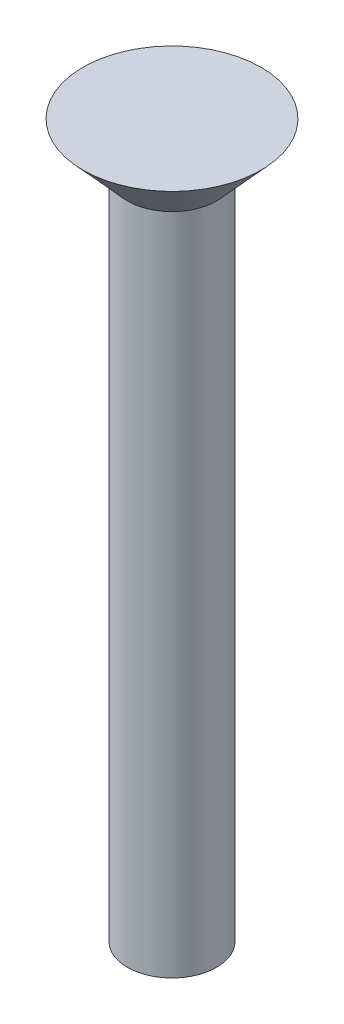
ISO-10303-21;
HEADER;
FILE_DESCRIPTION(('STEP AP214'),'2;1');
FILE_NAME('part.step','',(''),(''),'','','');
FILE_SCHEMA(('AUTOMOTIVE_DESIGN { 1 0 10303 214 1 1 1 1 }'));
ENDSEC;
DATA;
#1=APPLICATION_CONTEXT('core data for automotive mechanical design processes');
#2=APPLICATION_PROTOCOL_DEFINITION('international standard','automotive_design',2000,#1);
#3=PRODUCT_CONTEXT('',#1,'mechanical');
#4=PRODUCT('Part','Part','',(#3));
#5=PRODUCT_RELATED_PRODUCT_CATEGORY('part','',(#4));
#6=PRODUCT_DEFINITION_FORMATION('','',#4);
#7=PRODUCT_DEFINITION_CONTEXT('part definition',#1,'design');
#8=PRODUCT_DEFINITION('design','',#6,#7);
#9=PRODUCT_DEFINITION_SHAPE('','',#8);
#10=(LENGTH_UNIT() NAMED_UNIT(*) SI_UNIT(.MILLI.,.METRE.));
#11=(NAMED_UNIT(*) PLANE_ANGLE_UNIT() SI_UNIT($,.RADIAN.));
#12=(NAMED_UNIT(*) SI_UNIT($,.STERADIAN.) SOLID_ANGLE_UNIT());
#13=UNCERTAINTY_MEASURE_WITH_UNIT(LENGTH_MEASURE(1.E-05),#10,'distance_accuracy_value','');
#14=(GEOMETRIC_REPRESENTATION_CONTEXT(3) GLOBAL_UNCERTAINTY_ASSIGNED_CONTEXT((#13)) GLOBAL_UNIT_ASSIGNED_CONTEXT((#10,
#11,#12)) REPRESENTATION_CONTEXT('',''));
#15=CARTESIAN_POINT('',(0.,0.,0.));
#16=DIRECTION('',(0.,0.,1.));
#17=DIRECTION('',(1.,0.,0.));
#18=AXIS2_PLACEMENT_3D('',#15,#16,#17);
#19=CARTESIAN_POINT('',(0.,-35.1456310679612,0.));
#20=DIRECTION('',(0.,1.,0.));
#21=DIRECTION('',(0.,0.,1.));
#22=AXIS2_PLACEMENT_3D('',#19,#20,#21);
#23=PLANE('',#22);
#24=CARTESIAN_POINT('',(0.,-35.1456310679612,0.));
#25=DIRECTION('',(0.,1.,0.));
#26=DIRECTION('',(0.,0.,1.));
#27=AXIS2_PLACEMENT_3D('',#24,#25,#26);
#28=CIRCLE('',#27,5.);
#29=CARTESIAN_POINT('',(0.,-35.1456310679612,5.));
#30=VERTEX_POINT('',#29);
#31=EDGE_CURVE('E10',#30,#30,#28,.T.);
#32=ORIENTED_EDGE('',*,*,#31,.F.);
#33=EDGE_LOOP('',(#32));
#34=FACE_BOUND('',#33,.T.);
#35=ADVANCED_FACE('F30',(#34),#23,.F.);
#36=CARTESIAN_POINT('',(0.,44.8543689320388,0.));
#37=DIRECTION('',(0.,1.,0.));
#38=DIRECTION('',(0.,0.,1.));
#39=AXIS2_PLACEMENT_3D('',#36,#37,#38);
#40=CYLINDRICAL_SURFACE('',#39,5.);
#41=CARTESIAN_POINT('',(0.,39.3543689320388,0.));
#42=DIRECTION('',(0.,1.,0.));
#43=DIRECTION('',(0.,0.,1.));
#44=AXIS2_PLACEMENT_3D('',#41,#42,#43);
#45=CIRCLE('',#44,5.);
#46=CARTESIAN_POINT('',(0.,39.3543689320388,5.));
#47=VERTEX_POINT('',#46);
#48=EDGE_CURVE('E36',#47,#47,#45,.T.);
#49=ORIENTED_EDGE('',*,*,#48,.F.);
#50=EDGE_LOOP('',(#49));
#51=FACE_BOUND('',#50,.T.);
#52=ORIENTED_EDGE('',*,*,#31,.T.);
#53=EDGE_LOOP('',(#52));
#54=FACE_BOUND('',#53,.T.);
#55=ADVANCED_FACE('F51',(#51,#54),#40,.T.);
#56=CARTESIAN_POINT('',(0.,39.3543689320388,0.));
#57=DIRECTION('',(0.,1.,0.));
#58=DIRECTION('',(0.,0.,1.));
#59=AXIS2_PLACEMENT_3D('',#56,#57,#58);
#60=CONICAL_SURFACE('',#59,5.,0.737815060120465);
#61=CARTESIAN_POINT('',(0.,44.8543689320388,0.));
#62=DIRECTION('',(0.,1.,0.));
#63=DIRECTION('',(0.,0.,1.));
#64=AXIS2_PLACEMENT_3D('',#61,#62,#63);
#65=CIRCLE('',#64,9.99999999999999);
#66=CARTESIAN_POINT('',(0.,44.8543689320388,9.99999999999999));
#67=VERTEX_POINT('',#66);
#68=EDGE_CURVE('E40',#67,#67,#65,.T.);
#69=ORIENTED_EDGE('',*,*,#68,.F.);
#70=EDGE_LOOP('',(#69));
#71=FACE_BOUND('',#70,.T.);
#72=ORIENTED_EDGE('',*,*,#48,.T.);
#73=EDGE_LOOP('',(#72));
#74=FACE_BOUND('',#73,.T.);
#75=ADVANCED_FACE('F49',(#71,#74),#60,.T.);
#76=CARTESIAN_POINT('',(9.99999999999999,44.8543689320388,0.));
#77=DIRECTION('',(0.,-1.,0.));
#78=DIRECTION('',(0.,0.,-1.));
#79=AXIS2_PLACEMENT_3D('',#76,#77,#78);
#80=PLANE('',#79);
#81=ORIENTED_EDGE('',*,*,#68,.T.);
#82=EDGE_LOOP('',(#81));
#83=FACE_BOUND('',#82,.T.);
#84=ADVANCED_FACE('F47',(#83),#80,.F.);
#85=CLOSED_SHELL('',(#35,#55,#75,#84));
#86=MANIFOLD_SOLID_BREP('B2',#85);
#87=ADVANCED_BREP_SHAPE_REPRESENTATION('',(#18,#86),#14);
#88=SHAPE_DEFINITION_REPRESENTATION(#9,#87);
ENDSEC;
END-ISO-10303-21;
